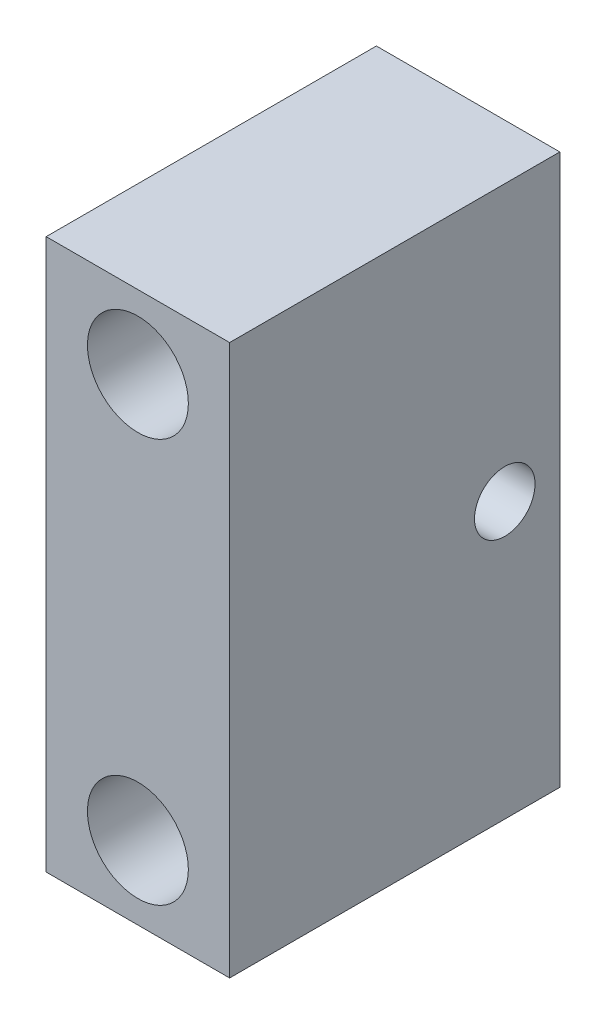
ISO-10303-21;
HEADER;
FILE_DESCRIPTION(('STEP AP214'),'2;1');
FILE_NAME('part.step','',(''),(''),'','','');
FILE_SCHEMA(('AUTOMOTIVE_DESIGN { 1 0 10303 214 1 1 1 1 }'));
ENDSEC;
DATA;
#1=APPLICATION_CONTEXT('core data for automotive mechanical design processes');
#2=APPLICATION_PROTOCOL_DEFINITION('international standard','automotive_design',2000,#1);
#3=PRODUCT_CONTEXT('',#1,'mechanical');
#4=PRODUCT('Part','Part','',(#3));
#5=PRODUCT_RELATED_PRODUCT_CATEGORY('part','',(#4));
#6=PRODUCT_DEFINITION_FORMATION('','',#4);
#7=PRODUCT_DEFINITION_CONTEXT('part definition',#1,'design');
#8=PRODUCT_DEFINITION('design','',#6,#7);
#9=PRODUCT_DEFINITION_SHAPE('','',#8);
#10=(LENGTH_UNIT() NAMED_UNIT(*) SI_UNIT(.MILLI.,.METRE.));
#11=(NAMED_UNIT(*) PLANE_ANGLE_UNIT() SI_UNIT($,.RADIAN.));
#12=(NAMED_UNIT(*) SI_UNIT($,.STERADIAN.) SOLID_ANGLE_UNIT());
#13=UNCERTAINTY_MEASURE_WITH_UNIT(LENGTH_MEASURE(1.E-05),#10,'distance_accuracy_value','');
#14=(GEOMETRIC_REPRESENTATION_CONTEXT(3) GLOBAL_UNCERTAINTY_ASSIGNED_CONTEXT((#13)) GLOBAL_UNIT_ASSIGNED_CONTEXT((#10,
#11,#12)) REPRESENTATION_CONTEXT('',''));
#15=CARTESIAN_POINT('',(0.,0.,0.));
#16=DIRECTION('',(0.,0.,1.));
#17=DIRECTION('',(1.,0.,0.));
#18=AXIS2_PLACEMENT_3D('',#15,#16,#17);
#19=CARTESIAN_POINT('',(0.,11.,-1.));
#20=DIRECTION('',(0.,0.,1.));
#21=DIRECTION('',(1.,0.,0.));
#22=AXIS2_PLACEMENT_3D('',#19,#20,#21);
#23=CYLINDRICAL_SURFACE('',#22,2.75);
#24=CARTESIAN_POINT('',(0.,11.,18.));
#25=DIRECTION('',(0.,0.,1.));
#26=DIRECTION('',(1.,0.,0.));
#27=AXIS2_PLACEMENT_3D('',#24,#25,#26);
#28=CIRCLE('',#27,2.75);
#29=CARTESIAN_POINT('',(2.75,11.,18.));
#30=VERTEX_POINT('',#29);
#31=EDGE_CURVE('E111',#30,#30,#28,.T.);
#32=ORIENTED_EDGE('',*,*,#31,.T.);
#33=EDGE_LOOP('',(#32));
#34=FACE_BOUND('',#33,.T.);
#35=CARTESIAN_POINT('',(0.,11.,0.));
#36=DIRECTION('',(0.,0.,1.));
#37=DIRECTION('',(1.,0.,0.));
#38=AXIS2_PLACEMENT_3D('',#35,#36,#37);
#39=CIRCLE('',#38,2.75);
#40=CARTESIAN_POINT('',(2.75,11.,0.));
#41=VERTEX_POINT('',#40);
#42=EDGE_CURVE('E118',#41,#41,#39,.T.);
#43=ORIENTED_EDGE('',*,*,#42,.F.);
#44=EDGE_LOOP('',(#43));
#45=FACE_BOUND('',#44,.T.);
#46=ADVANCED_FACE('F16',(#34,#45),#23,.F.);
#47=CARTESIAN_POINT('',(0.,-11.,-1.));
#48=DIRECTION('',(0.,0.,1.));
#49=DIRECTION('',(1.,0.,0.));
#50=AXIS2_PLACEMENT_3D('',#47,#48,#49);
#51=CYLINDRICAL_SURFACE('',#50,2.75);
#52=CARTESIAN_POINT('',(0.,-11.,18.));
#53=DIRECTION('',(0.,0.,1.));
#54=DIRECTION('',(1.,0.,0.));
#55=AXIS2_PLACEMENT_3D('',#52,#53,#54);
#56=CIRCLE('',#55,2.75);
#57=CARTESIAN_POINT('',(2.75,-11.,18.));
#58=VERTEX_POINT('',#57);
#59=EDGE_CURVE('E102',#58,#58,#56,.T.);
#60=ORIENTED_EDGE('',*,*,#59,.T.);
#61=EDGE_LOOP('',(#60));
#62=FACE_BOUND('',#61,.T.);
#63=CARTESIAN_POINT('',(0.,-11.,0.));
#64=DIRECTION('',(0.,0.,1.));
#65=DIRECTION('',(1.,0.,0.));
#66=AXIS2_PLACEMENT_3D('',#63,#64,#65);
#67=CIRCLE('',#66,2.75);
#68=CARTESIAN_POINT('',(2.75,-11.,0.));
#69=VERTEX_POINT('',#68);
#70=EDGE_CURVE('E106',#69,#69,#67,.T.);
#71=ORIENTED_EDGE('',*,*,#70,.F.);
#72=EDGE_LOOP('',(#71));
#73=FACE_BOUND('',#72,.T.);
#74=ADVANCED_FACE('F161',(#62,#73),#51,.F.);
#75=CARTESIAN_POINT('',(5.,-15.,0.));
#76=DIRECTION('',(1.,0.,0.));
#77=DIRECTION('',(0.,1.,0.));
#78=AXIS2_PLACEMENT_3D('',#75,#76,#77);
#79=PLANE('',#78);
#80=CARTESIAN_POINT('',(5.,0.,3.));
#81=DIRECTION('',(1.,0.,0.));
#82=DIRECTION('',(0.,0.,1.));
#83=AXIS2_PLACEMENT_3D('',#80,#81,#82);
#84=CIRCLE('',#83,1.65);
#85=CARTESIAN_POINT('',(5.,0.,4.65));
#86=VERTEX_POINT('',#85);
#87=EDGE_CURVE('E10',#86,#86,#84,.T.);
#88=ORIENTED_EDGE('',*,*,#87,.F.);
#89=EDGE_LOOP('',(#88));
#90=FACE_BOUND('',#89,.T.);
#91=DIRECTION('',(0.,0.,1.));
#92=VECTOR('',#91,1.);
#93=CARTESIAN_POINT('',(5.,-15.,0.));
#94=LINE('',#93,#92);
#95=CARTESIAN_POINT('',(5.,-15.,0.));
#96=VERTEX_POINT('',#95);
#97=CARTESIAN_POINT('',(5.,-15.,18.));
#98=VERTEX_POINT('',#97);
#99=EDGE_CURVE('E68',#96,#98,#94,.T.);
#100=ORIENTED_EDGE('',*,*,#99,.F.);
#101=DIRECTION('',(0.,1.,0.));
#102=VECTOR('',#101,1.);
#103=CARTESIAN_POINT('',(5.,-15.,0.));
#104=LINE('',#103,#102);
#105=CARTESIAN_POINT('',(5.,15.,0.));
#106=VERTEX_POINT('',#105);
#107=EDGE_CURVE('E103',#96,#106,#104,.T.);
#108=ORIENTED_EDGE('',*,*,#107,.T.);
#109=DIRECTION('',(0.,0.,1.));
#110=VECTOR('',#109,1.);
#111=CARTESIAN_POINT('',(5.,15.,0.));
#112=LINE('',#111,#110);
#113=CARTESIAN_POINT('',(5.,15.,18.));
#114=VERTEX_POINT('',#113);
#115=EDGE_CURVE('E25',#106,#114,#112,.T.);
#116=ORIENTED_EDGE('',*,*,#115,.T.);
#117=DIRECTION('',(0.,1.,0.));
#118=VECTOR('',#117,1.);
#119=CARTESIAN_POINT('',(5.,-15.,18.));
#120=LINE('',#119,#118);
#121=EDGE_CURVE('E64',#98,#114,#120,.T.);
#122=ORIENTED_EDGE('',*,*,#121,.F.);
#123=EDGE_LOOP('',(#100,#108,#116,#122));
#124=FACE_BOUND('',#123,.T.);
#125=ADVANCED_FACE('F66',(#90,#124),#79,.T.);
#126=CARTESIAN_POINT('',(-6.,0.,3.));
#127=DIRECTION('',(1.,0.,0.));
#128=DIRECTION('',(0.,0.,1.));
#129=AXIS2_PLACEMENT_3D('',#126,#127,#128);
#130=CYLINDRICAL_SURFACE('',#129,1.65);
#131=ORIENTED_EDGE('',*,*,#87,.T.);
#132=EDGE_LOOP('',(#131));
#133=FACE_BOUND('',#132,.T.);
#134=CARTESIAN_POINT('',(-5.,0.,3.));
#135=DIRECTION('',(1.,0.,0.));
#136=DIRECTION('',(0.,0.,1.));
#137=AXIS2_PLACEMENT_3D('',#134,#135,#136);
#138=CIRCLE('',#137,1.65);
#139=CARTESIAN_POINT('',(-5.,0.,4.65));
#140=VERTEX_POINT('',#139);
#141=EDGE_CURVE('E87',#140,#140,#138,.T.);
#142=ORIENTED_EDGE('',*,*,#141,.F.);
#143=EDGE_LOOP('',(#142));
#144=FACE_BOUND('',#143,.T.);
#145=ADVANCED_FACE('F150',(#133,#144),#130,.F.);
#146=CARTESIAN_POINT('',(-5.,15.,0.));
#147=DIRECTION('',(0.,1.,0.));
#148=DIRECTION('',(1.,0.,0.));
#149=AXIS2_PLACEMENT_3D('',#146,#147,#148);
#150=PLANE('',#149);
#151=DIRECTION('',(1.,0.,0.));
#152=VECTOR('',#151,1.);
#153=CARTESIAN_POINT('',(-5.,15.,0.));
#154=LINE('',#153,#152);
#155=CARTESIAN_POINT('',(-5.,15.,0.));
#156=VERTEX_POINT('',#155);
#157=EDGE_CURVE('E107',#156,#106,#154,.T.);
#158=ORIENTED_EDGE('',*,*,#157,.F.);
#159=DIRECTION('',(0.,0.,1.));
#160=VECTOR('',#159,1.);
#161=CARTESIAN_POINT('',(-5.,15.,0.));
#162=LINE('',#161,#160);
#163=CARTESIAN_POINT('',(-5.,15.,18.));
#164=VERTEX_POINT('',#163);
#165=EDGE_CURVE('E132',#156,#164,#162,.T.);
#166=ORIENTED_EDGE('',*,*,#165,.T.);
#167=DIRECTION('',(1.,0.,0.));
#168=VECTOR('',#167,1.);
#169=CARTESIAN_POINT('',(-5.,15.,18.));
#170=LINE('',#169,#168);
#171=EDGE_CURVE('E71',#164,#114,#170,.T.);
#172=ORIENTED_EDGE('',*,*,#171,.T.);
#173=ORIENTED_EDGE('',*,*,#115,.F.);
#174=EDGE_LOOP('',(#158,#166,#172,#173));
#175=FACE_BOUND('',#174,.T.);
#176=ADVANCED_FACE('F148',(#175),#150,.T.);
#177=CARTESIAN_POINT('',(-5.,-15.,0.));
#178=DIRECTION('',(0.,0.,1.));
#179=DIRECTION('',(1.,0.,0.));
#180=AXIS2_PLACEMENT_3D('',#177,#178,#179);
#181=PLANE('',#180);
#182=ORIENTED_EDGE('',*,*,#42,.T.);
#183=EDGE_LOOP('',(#182));
#184=FACE_BOUND('',#183,.T.);
#185=ORIENTED_EDGE('',*,*,#70,.T.);
#186=EDGE_LOOP('',(#185));
#187=FACE_BOUND('',#186,.T.);
#188=ORIENTED_EDGE('',*,*,#157,.T.);
#189=ORIENTED_EDGE('',*,*,#107,.F.);
#190=DIRECTION('',(1.,0.,0.));
#191=VECTOR('',#190,1.);
#192=CARTESIAN_POINT('',(-5.,-15.,0.));
#193=LINE('',#192,#191);
#194=CARTESIAN_POINT('',(-5.,-15.,0.));
#195=VERTEX_POINT('',#194);
#196=EDGE_CURVE('E72',#195,#96,#193,.T.);
#197=ORIENTED_EDGE('',*,*,#196,.F.);
#198=DIRECTION('',(0.,1.,0.));
#199=VECTOR('',#198,1.);
#200=CARTESIAN_POINT('',(-5.,-15.,0.));
#201=LINE('',#200,#199);
#202=EDGE_CURVE('E130',#195,#156,#201,.T.);
#203=ORIENTED_EDGE('',*,*,#202,.T.);
#204=EDGE_LOOP('',(#188,#189,#197,#203));
#205=FACE_BOUND('',#204,.T.);
#206=ADVANCED_FACE('F147',(#184,#187,#205),#181,.F.);
#207=CARTESIAN_POINT('',(-5.,-15.,18.));
#208=DIRECTION('',(0.,0.,1.));
#209=DIRECTION('',(1.,0.,0.));
#210=AXIS2_PLACEMENT_3D('',#207,#208,#209);
#211=PLANE('',#210);
#212=ORIENTED_EDGE('',*,*,#31,.F.);
#213=EDGE_LOOP('',(#212));
#214=FACE_BOUND('',#213,.T.);
#215=ORIENTED_EDGE('',*,*,#59,.F.);
#216=EDGE_LOOP('',(#215));
#217=FACE_BOUND('',#216,.T.);
#218=DIRECTION('',(0.,1.,0.));
#219=VECTOR('',#218,1.);
#220=CARTESIAN_POINT('',(-5.,-15.,18.));
#221=LINE('',#220,#219);
#222=CARTESIAN_POINT('',(-5.,-15.,18.));
#223=VERTEX_POINT('',#222);
#224=EDGE_CURVE('E78',#223,#164,#221,.T.);
#225=ORIENTED_EDGE('',*,*,#224,.F.);
#226=DIRECTION('',(1.,0.,0.));
#227=VECTOR('',#226,1.);
#228=CARTESIAN_POINT('',(-5.,-15.,18.));
#229=LINE('',#228,#227);
#230=EDGE_CURVE('E75',#223,#98,#229,.T.);
#231=ORIENTED_EDGE('',*,*,#230,.T.);
#232=ORIENTED_EDGE('',*,*,#121,.T.);
#233=ORIENTED_EDGE('',*,*,#171,.F.);
#234=EDGE_LOOP('',(#225,#231,#232,#233));
#235=FACE_BOUND('',#234,.T.);
#236=ADVANCED_FACE('F76',(#214,#217,#235),#211,.T.);
#237=CARTESIAN_POINT('',(-5.,-15.,0.));
#238=DIRECTION('',(0.,1.,0.));
#239=DIRECTION('',(1.,0.,0.));
#240=AXIS2_PLACEMENT_3D('',#237,#238,#239);
#241=PLANE('',#240);
#242=ORIENTED_EDGE('',*,*,#99,.T.);
#243=ORIENTED_EDGE('',*,*,#230,.F.);
#244=DIRECTION('',(0.,0.,1.));
#245=VECTOR('',#244,1.);
#246=CARTESIAN_POINT('',(-5.,-15.,0.));
#247=LINE('',#246,#245);
#248=EDGE_CURVE('E93',#195,#223,#247,.T.);
#249=ORIENTED_EDGE('',*,*,#248,.F.);
#250=ORIENTED_EDGE('',*,*,#196,.T.);
#251=EDGE_LOOP('',(#242,#243,#249,#250));
#252=FACE_BOUND('',#251,.T.);
#253=ADVANCED_FACE('F85',(#252),#241,.F.);
#254=CARTESIAN_POINT('',(-5.,-15.,0.));
#255=DIRECTION('',(1.,0.,0.));
#256=DIRECTION('',(0.,1.,0.));
#257=AXIS2_PLACEMENT_3D('',#254,#255,#256);
#258=PLANE('',#257);
#259=ORIENTED_EDGE('',*,*,#141,.T.);
#260=EDGE_LOOP('',(#259));
#261=FACE_BOUND('',#260,.T.);
#262=ORIENTED_EDGE('',*,*,#224,.T.);
#263=ORIENTED_EDGE('',*,*,#165,.F.);
#264=ORIENTED_EDGE('',*,*,#202,.F.);
#265=ORIENTED_EDGE('',*,*,#248,.T.);
#266=EDGE_LOOP('',(#262,#263,#264,#265));
#267=FACE_BOUND('',#266,.T.);
#268=ADVANCED_FACE('F141',(#261,#267),#258,.F.);
#269=CLOSED_SHELL('',(#46,#74,#125,#145,#176,#206,#236,#253,#268));
#270=MANIFOLD_SOLID_BREP('B1',#269);
#271=ADVANCED_BREP_SHAPE_REPRESENTATION('',(#18,#270),#14);
#272=SHAPE_DEFINITION_REPRESENTATION(#9,#271);
ENDSEC;
END-ISO-10303-21;
